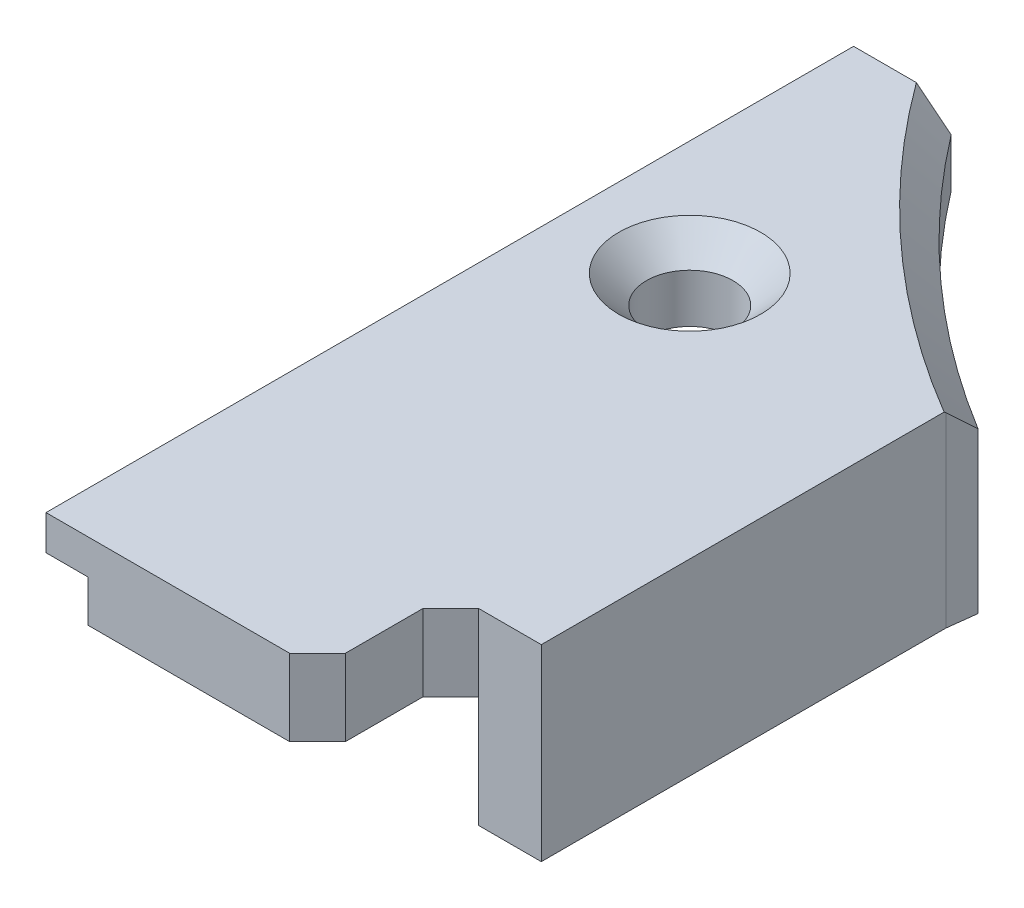
ISO-10303-21;
HEADER;
FILE_DESCRIPTION(('STEP AP214'),'2;1');
FILE_NAME('part.step','',(''),(''),'','','');
FILE_SCHEMA(('AUTOMOTIVE_DESIGN { 1 0 10303 214 1 1 1 1 }'));
ENDSEC;
DATA;
#1=APPLICATION_CONTEXT('core data for automotive mechanical design processes');
#2=APPLICATION_PROTOCOL_DEFINITION('international standard','automotive_design',2000,#1);
#3=PRODUCT_CONTEXT('',#1,'mechanical');
#4=PRODUCT('Part','Part','',(#3));
#5=PRODUCT_RELATED_PRODUCT_CATEGORY('part','',(#4));
#6=PRODUCT_DEFINITION_FORMATION('','',#4);
#7=PRODUCT_DEFINITION_CONTEXT('part definition',#1,'design');
#8=PRODUCT_DEFINITION('design','',#6,#7);
#9=PRODUCT_DEFINITION_SHAPE('','',#8);
#10=(LENGTH_UNIT() NAMED_UNIT(*) SI_UNIT(.MILLI.,.METRE.));
#11=(NAMED_UNIT(*) PLANE_ANGLE_UNIT() SI_UNIT($,.RADIAN.));
#12=(NAMED_UNIT(*) SI_UNIT($,.STERADIAN.) SOLID_ANGLE_UNIT());
#13=UNCERTAINTY_MEASURE_WITH_UNIT(LENGTH_MEASURE(1.E-05),#10,'distance_accuracy_value','');
#14=(GEOMETRIC_REPRESENTATION_CONTEXT(3) GLOBAL_UNCERTAINTY_ASSIGNED_CONTEXT((#13)) GLOBAL_UNIT_ASSIGNED_CONTEXT((#10,
#11,#12)) REPRESENTATION_CONTEXT('',''));
#15=CARTESIAN_POINT('',(0.,0.,0.));
#16=DIRECTION('',(0.,0.,1.));
#17=DIRECTION('',(1.,0.,0.));
#18=AXIS2_PLACEMENT_3D('',#15,#16,#17);
#19=CARTESIAN_POINT('',(0.,2.75,-10.0000000000344));
#20=DIRECTION('',(0.,0.,-1.));
#21=DIRECTION('',(-1.,0.,0.));
#22=AXIS2_PLACEMENT_3D('',#19,#20,#21);
#23=PLANE('',#22);
#24=DIRECTION('',(1.,0.,0.));
#25=VECTOR('',#24,1.);
#26=CARTESIAN_POINT('',(0.,2.75,-10.0000000000344));
#27=LINE('',#26,#25);
#28=CARTESIAN_POINT('',(12.75,2.75,-10.0000000000344));
#29=VERTEX_POINT('',#28);
#30=CARTESIAN_POINT('',(15.0042692933623,2.75,-10.0000000000345));
#31=VERTEX_POINT('',#30);
#32=EDGE_CURVE('E216',#29,#31,#27,.T.);
#33=ORIENTED_EDGE('',*,*,#32,.T.);
#34=CARTESIAN_POINT('',(15.0042692933623,2.75,-10.0000000000345));
#35=CARTESIAN_POINT('',(15.2117492556178,2.58253583239888,-10.0000000000345));
#36=CARTESIAN_POINT('',(15.4195485507509,2.41547041954059,-10.0000000000345));
#37=CARTESIAN_POINT('',(15.8357858282312,2.08213708612503,-10.0000000000345));
#38=CARTESIAN_POINT('',(16.0442238106442,1.91586916564998,-10.0000000000345));
#39=CARTESIAN_POINT('',(16.2529811260008,1.75,-10.0000000000345));
#40=B_SPLINE_CURVE_WITH_KNOTS('',3,(#34,#35,#36,#37,#38,#39),.UNSPECIFIED.,.F.,.F.,(4,2,4),(0.,
0.7998891129913,1.59977830845748),.UNSPECIFIED.);
#41=CARTESIAN_POINT('',(16.2529811260008,1.75,-10.0000000000345));
#42=VERTEX_POINT('',#41);
#43=EDGE_CURVE('E275',#31,#42,#40,.T.);
#44=ORIENTED_EDGE('',*,*,#43,.T.);
#45=DIRECTION('',(0.,-1.,0.));
#46=VECTOR('',#45,1.);
#47=CARTESIAN_POINT('',(16.2529811260008,2.75,-10.0000000000345));
#48=LINE('',#47,#46);
#49=CARTESIAN_POINT('',(16.2529811260008,0.,-10.0000000000345));
#50=VERTEX_POINT('',#49);
#51=EDGE_CURVE('E223',#42,#50,#48,.T.);
#52=ORIENTED_EDGE('',*,*,#51,.T.);
#53=DIRECTION('',(1.,0.,0.));
#54=VECTOR('',#53,1.);
#55=CARTESIAN_POINT('',(0.,0.,-10.0000000000344));
#56=LINE('',#55,#54);
#57=CARTESIAN_POINT('',(14.25,0.,-10.0000000000344));
#58=VERTEX_POINT('',#57);
#59=EDGE_CURVE('E225',#58,#50,#56,.T.);
#60=ORIENTED_EDGE('',*,*,#59,.F.);
#61=DIRECTION('',(0.,-1.,0.));
#62=VECTOR('',#61,1.);
#63=CARTESIAN_POINT('',(14.25,1.5,-10.0000000000344));
#64=LINE('',#63,#62);
#65=CARTESIAN_POINT('',(14.25,1.5,-10.0000000000344));
#66=VERTEX_POINT('',#65);
#67=EDGE_CURVE('E411',#66,#58,#64,.T.);
#68=ORIENTED_EDGE('',*,*,#67,.F.);
#69=DIRECTION('',(-1.,0.,0.));
#70=VECTOR('',#69,1.);
#71=CARTESIAN_POINT('',(12.5,1.5,-10.0000000000344));
#72=LINE('',#71,#70);
#73=CARTESIAN_POINT('',(12.75,1.5,-10.0000000000344));
#74=VERTEX_POINT('',#73);
#75=EDGE_CURVE('E408',#66,#74,#72,.T.);
#76=ORIENTED_EDGE('',*,*,#75,.T.);
#77=DIRECTION('',(0.,-1.,0.));
#78=VECTOR('',#77,1.);
#79=CARTESIAN_POINT('',(12.75,2.75,-10.0000000000344));
#80=LINE('',#79,#78);
#81=EDGE_CURVE('E398',#29,#74,#80,.T.);
#82=ORIENTED_EDGE('',*,*,#81,.F.);
#83=EDGE_LOOP('',(#33,#44,#52,#60,#68,#76,#82));
#84=FACE_BOUND('',#83,.T.);
#85=ADVANCED_FACE('F39',(#84),#23,.T.);
#86=CARTESIAN_POINT('',(12.5,13.8207949147356,18.9998850900372));
#87=DIRECTION('',(0.,0.,-1.));
#88=DIRECTION('',(-1.,0.,0.));
#89=AXIS2_PLACEMENT_3D('',#86,#87,#88);
#90=PLANE('',#89);
#91=DIRECTION('',(1.,0.,0.));
#92=VECTOR('',#91,1.);
#93=CARTESIAN_POINT('',(12.5,0.,18.9998850900372));
#94=LINE('',#93,#92);
#95=CARTESIAN_POINT('',(14.25,0.,18.9998850900372));
#96=VERTEX_POINT('',#95);
#97=CARTESIAN_POINT('',(21.5000000022068,0.,18.9998850900372));
#98=VERTEX_POINT('',#97);
#99=EDGE_CURVE('E210',#96,#98,#94,.T.);
#100=ORIENTED_EDGE('',*,*,#99,.T.);
#101=DIRECTION('',(0.,1.,0.));
#102=VECTOR('',#101,1.);
#103=CARTESIAN_POINT('',(21.5000000022068,13.8207949147356,18.9998850900372));
#104=LINE('',#103,#102);
#105=CARTESIAN_POINT('',(21.5000000022068,2.75,18.9998850900372));
#106=VERTEX_POINT('',#105);
#107=EDGE_CURVE('E312',#98,#106,#104,.T.);
#108=ORIENTED_EDGE('',*,*,#107,.T.);
#109=DIRECTION('',(1.,0.,0.));
#110=VECTOR('',#109,1.);
#111=CARTESIAN_POINT('',(12.5,2.75,18.9998850900372));
#112=LINE('',#111,#110);
#113=CARTESIAN_POINT('',(12.75,2.75,18.9998850900372));
#114=VERTEX_POINT('',#113);
#115=EDGE_CURVE('E212',#114,#106,#112,.T.);
#116=ORIENTED_EDGE('',*,*,#115,.F.);
#117=DIRECTION('',(0.,-1.,0.));
#118=VECTOR('',#117,1.);
#119=CARTESIAN_POINT('',(12.75,2.75,18.9998850900372));
#120=LINE('',#119,#118);
#121=CARTESIAN_POINT('',(12.75,1.5,18.9998850900372));
#122=VERTEX_POINT('',#121);
#123=EDGE_CURVE('E400',#114,#122,#120,.T.);
#124=ORIENTED_EDGE('',*,*,#123,.T.);
#125=DIRECTION('',(1.,0.,0.));
#126=VECTOR('',#125,1.);
#127=CARTESIAN_POINT('',(14.25,1.5,18.9998850900372));
#128=LINE('',#127,#126);
#129=CARTESIAN_POINT('',(14.25,1.5,18.9998850900372));
#130=VERTEX_POINT('',#129);
#131=EDGE_CURVE('E404',#122,#130,#128,.T.);
#132=ORIENTED_EDGE('',*,*,#131,.T.);
#133=DIRECTION('',(0.,-1.,0.));
#134=VECTOR('',#133,1.);
#135=CARTESIAN_POINT('',(14.25,1.5,18.9998850900372));
#136=LINE('',#135,#134);
#137=EDGE_CURVE('E197',#130,#96,#136,.T.);
#138=ORIENTED_EDGE('',*,*,#137,.T.);
#139=EDGE_LOOP('',(#100,#108,#116,#124,#132,#138));
#140=FACE_BOUND('',#139,.T.);
#141=ADVANCED_FACE('F288',(#140),#90,.F.);
#142=CARTESIAN_POINT('',(0.,2.75,0.));
#143=DIRECTION('',(0.,1.,0.));
#144=DIRECTION('',(0.,0.,1.));
#145=AXIS2_PLACEMENT_3D('',#142,#143,#144);
#146=PLANE('',#145);
#147=CARTESIAN_POINT('',(16.865979255,2.75,0.));
#148=DIRECTION('',(0.,1.,0.));
#149=DIRECTION('',(0.,0.,1.));
#150=AXIS2_PLACEMENT_3D('',#147,#148,#149);
#151=CIRCLE('',#150,2.55);
#152=CARTESIAN_POINT('',(16.865979255,2.75,2.55));
#153=VERTEX_POINT('',#152);
#154=EDGE_CURVE('E48',#153,#153,#151,.F.);
#155=ORIENTED_EDGE('',*,*,#154,.T.);
#156=EDGE_LOOP('',(#155));
#157=FACE_BOUND('',#156,.T.);
#158=DIRECTION('',(0.,0.,-1.));
#159=VECTOR('',#158,1.);
#160=CARTESIAN_POINT('',(25.7500000022048,2.75,0.));
#161=LINE('',#160,#159);
#162=CARTESIAN_POINT('',(25.7500000022048,2.75,14.2136291741262));
#163=VERTEX_POINT('',#162);
#164=CARTESIAN_POINT('',(25.7500000022048,2.75,-0.251054000046067));
#165=VERTEX_POINT('',#164);
#166=EDGE_CURVE('E200',#163,#165,#161,.T.);
#167=ORIENTED_EDGE('',*,*,#166,.T.);
#168=CARTESIAN_POINT('',(44.1426755627633,2.75,-31.3209847267169));
#169=DIRECTION('',(0.,1.,0.));
#170=DIRECTION('',(0.,0.,1.));
#171=AXIS2_PLACEMENT_3D('',#168,#169,#170);
#172=CIRCLE('',#171,36.1058320723411);
#173=EDGE_CURVE('E283',#165,#31,#172,.F.);
#174=ORIENTED_EDGE('',*,*,#173,.T.);
#175=ORIENTED_EDGE('',*,*,#32,.F.);
#176=DIRECTION('',(0.,0.,-1.));
#177=VECTOR('',#176,1.);
#178=CARTESIAN_POINT('',(12.75,2.75,-10.0000000000344));
#179=LINE('',#178,#177);
#180=EDGE_CURVE('E180',#114,#29,#179,.T.);
#181=ORIENTED_EDGE('',*,*,#180,.F.);
#182=ORIENTED_EDGE('',*,*,#115,.T.);
#183=DIRECTION('',(-0.707106781186549,0.,0.707106781186546));
#184=VECTOR('',#183,1.);
#185=CARTESIAN_POINT('',(20.2499425461219,2.75,20.249942546122));
#186=LINE('',#185,#184);
#187=CARTESIAN_POINT('',(22.5000000022068,2.75,17.9998850900372));
#188=VERTEX_POINT('',#187);
#189=EDGE_CURVE('E320',#106,#188,#186,.F.);
#190=ORIENTED_EDGE('',*,*,#189,.T.);
#191=DIRECTION('',(0.,0.,-1.));
#192=VECTOR('',#191,1.);
#193=CARTESIAN_POINT('',(22.5000000022068,2.75,0.));
#194=LINE('',#193,#192);
#195=CARTESIAN_POINT('',(22.5000000022068,2.75,15.2136291741262));
#196=VERTEX_POINT('',#195);
#197=EDGE_CURVE('E219',#188,#196,#194,.T.);
#198=ORIENTED_EDGE('',*,*,#197,.T.);
#199=DIRECTION('',(-0.70710678118655,0.,0.707106781186545));
#200=VECTOR('',#199,1.);
#201=CARTESIAN_POINT('',(23.5000000022068,2.75,14.2136291741262));
#202=LINE('',#201,#200);
#203=CARTESIAN_POINT('',(23.5000000022068,2.75,14.2136291741262));
#204=VERTEX_POINT('',#203);
#205=EDGE_CURVE('E323',#196,#204,#202,.F.);
#206=ORIENTED_EDGE('',*,*,#205,.T.);
#207=DIRECTION('',(1.,0.,0.));
#208=VECTOR('',#207,1.);
#209=CARTESIAN_POINT('',(0.,2.75,14.2136291741262));
#210=LINE('',#209,#208);
#211=EDGE_CURVE('E191',#204,#163,#210,.T.);
#212=ORIENTED_EDGE('',*,*,#211,.T.);
#213=EDGE_LOOP('',(#167,#174,#175,#181,#182,#190,#198,#206,#212));
#214=FACE_BOUND('',#213,.T.);
#215=ADVANCED_FACE('F302',(#157,#214),#146,.T.);
#216=CARTESIAN_POINT('',(0.,1.5,0.));
#217=DIRECTION('',(0.,-1.,0.));
#218=DIRECTION('',(0.,0.,-1.));
#219=AXIS2_PLACEMENT_3D('',#216,#217,#218);
#220=PLANE('',#219);
#221=ORIENTED_EDGE('',*,*,#131,.F.);
#222=DIRECTION('',(0.,0.,-1.));
#223=VECTOR('',#222,1.);
#224=CARTESIAN_POINT('',(12.75,1.5,0.));
#225=LINE('',#224,#223);
#226=EDGE_CURVE('E234',#122,#74,#225,.T.);
#227=ORIENTED_EDGE('',*,*,#226,.T.);
#228=ORIENTED_EDGE('',*,*,#75,.F.);
#229=DIRECTION('',(0.,0.,-1.));
#230=VECTOR('',#229,1.);
#231=CARTESIAN_POINT('',(14.25,1.5,-10.0000000000344));
#232=LINE('',#231,#230);
#233=EDGE_CURVE('E406',#130,#66,#232,.T.);
#234=ORIENTED_EDGE('',*,*,#233,.F.);
#235=EDGE_LOOP('',(#221,#227,#228,#234));
#236=FACE_BOUND('',#235,.T.);
#237=ADVANCED_FACE('F301',(#236),#220,.T.);
#238=CARTESIAN_POINT('',(0.,0.,0.));
#239=DIRECTION('',(0.,1.,0.));
#240=DIRECTION('',(0.,0.,1.));
#241=AXIS2_PLACEMENT_3D('',#238,#239,#240);
#242=PLANE('',#241);
#243=DIRECTION('',(-1.,0.,0.));
#244=VECTOR('',#243,1.);
#245=CARTESIAN_POINT('',(0.,0.,7.51362917405731));
#246=LINE('',#245,#244);
#247=CARTESIAN_POINT('',(24.7500000022057,0.,7.51362917405731));
#248=VERTEX_POINT('',#247);
#249=CARTESIAN_POINT('',(23.5000000022068,0.,7.51362917405731));
#250=VERTEX_POINT('',#249);
#251=EDGE_CURVE('E181',#248,#250,#246,.T.);
#252=ORIENTED_EDGE('',*,*,#251,.T.);
#253=DIRECTION('',(0.,0.,1.));
#254=VECTOR('',#253,1.);
#255=CARTESIAN_POINT('',(23.5000000022068,0.,0.));
#256=LINE('',#255,#254);
#257=CARTESIAN_POINT('',(23.5000000022068,0.,14.2136291741262));
#258=VERTEX_POINT('',#257);
#259=EDGE_CURVE('E179',#250,#258,#256,.T.);
#260=ORIENTED_EDGE('',*,*,#259,.T.);
#261=DIRECTION('',(0.70710678118655,0.,-0.707106781186545));
#262=VECTOR('',#261,1.);
#263=CARTESIAN_POINT('',(18.8568145881664,0.,18.8568145881665));
#264=LINE('',#263,#262);
#265=CARTESIAN_POINT('',(22.5000000022068,0.,15.2136291741262));
#266=VERTEX_POINT('',#265);
#267=EDGE_CURVE('E321',#258,#266,#264,.F.);
#268=ORIENTED_EDGE('',*,*,#267,.T.);
#269=DIRECTION('',(0.,0.,-1.));
#270=VECTOR('',#269,1.);
#271=CARTESIAN_POINT('',(22.5000000022068,0.,0.));
#272=LINE('',#271,#270);
#273=CARTESIAN_POINT('',(22.5000000022068,0.,17.9998850900372));
#274=VERTEX_POINT('',#273);
#275=EDGE_CURVE('E228',#274,#266,#272,.T.);
#276=ORIENTED_EDGE('',*,*,#275,.F.);
#277=DIRECTION('',(0.707106781186549,0.,-0.707106781186546));
#278=VECTOR('',#277,1.);
#279=CARTESIAN_POINT('',(22.5000000022068,0.,17.9998850900372));
#280=LINE('',#279,#278);
#281=EDGE_CURVE('E63',#274,#98,#280,.F.);
#282=ORIENTED_EDGE('',*,*,#281,.T.);
#283=ORIENTED_EDGE('',*,*,#99,.F.);
#284=DIRECTION('',(0.,0.,-1.));
#285=VECTOR('',#284,1.);
#286=CARTESIAN_POINT('',(14.25,0.,-10.0000000000344));
#287=LINE('',#286,#285);
#288=EDGE_CURVE('E403',#96,#58,#287,.T.);
#289=ORIENTED_EDGE('',*,*,#288,.T.);
#290=ORIENTED_EDGE('',*,*,#59,.T.);
#291=CARTESIAN_POINT('',(44.1426755627633,0.,-31.3209847267169));
#292=DIRECTION('',(0.,1.,0.));
#293=DIRECTION('',(0.,0.,1.));
#294=AXIS2_PLACEMENT_3D('',#291,#292,#293);
#295=CIRCLE('',#294,35.1058320723411);
#296=CARTESIAN_POINT('',(24.9466325339046,0.,-1.92827512849145));
#297=VERTEX_POINT('',#296);
#298=EDGE_CURVE('E215',#50,#297,#295,.T.);
#299=ORIENTED_EDGE('',*,*,#298,.T.);
#300=DIRECTION('',(-0.12080275843464,0.,0.992676530172131));
#301=VECTOR('',#300,1.);
#302=CARTESIAN_POINT('',(24.3513436620657,0.,2.96341194392631));
#303=LINE('',#302,#301);
#304=CARTESIAN_POINT('',(24.7500000022057,0.,-0.312480076994557));
#305=VERTEX_POINT('',#304);
#306=EDGE_CURVE('E393',#297,#305,#303,.T.);
#307=ORIENTED_EDGE('',*,*,#306,.T.);
#308=DIRECTION('',(0.,0.,1.));
#309=VECTOR('',#308,1.);
#310=CARTESIAN_POINT('',(24.7500000022057,0.,0.));
#311=LINE('',#310,#309);
#312=EDGE_CURVE('E384',#305,#248,#311,.T.);
#313=ORIENTED_EDGE('',*,*,#312,.T.);
#314=EDGE_LOOP('',(#252,#260,#268,#276,#282,#283,#289,#290,#299,#307,#313));
#315=FACE_BOUND('',#314,.T.);
#316=CARTESIAN_POINT('',(16.865979255,0.,0.));
#317=DIRECTION('',(0.,1.,0.));
#318=DIRECTION('',(0.,0.,1.));
#319=AXIS2_PLACEMENT_3D('',#316,#317,#318);
#320=CIRCLE('',#319,1.55);
#321=CARTESIAN_POINT('',(16.865979255,0.,1.55));
#322=VERTEX_POINT('',#321);
#323=EDGE_CURVE('E220',#322,#322,#320,.F.);
#324=ORIENTED_EDGE('',*,*,#323,.F.);
#325=EDGE_LOOP('',(#324));
#326=FACE_BOUND('',#325,.T.);
#327=ADVANCED_FACE('F293',(#315,#326),#242,.F.);
#328=CARTESIAN_POINT('',(22.5000000022068,2.75,0.));
#329=DIRECTION('',(-1.,0.,0.));
#330=DIRECTION('',(0.,0.,1.));
#331=AXIS2_PLACEMENT_3D('',#328,#329,#330);
#332=PLANE('',#331);
#333=ORIENTED_EDGE('',*,*,#275,.T.);
#334=DIRECTION('',(0.,1.,0.));
#335=VECTOR('',#334,1.);
#336=CARTESIAN_POINT('',(22.5000000022068,2.75,15.2136291741262));
#337=LINE('',#336,#335);
#338=EDGE_CURVE('E325',#266,#196,#337,.T.);
#339=ORIENTED_EDGE('',*,*,#338,.T.);
#340=ORIENTED_EDGE('',*,*,#197,.F.);
#341=DIRECTION('',(0.,-1.,0.));
#342=VECTOR('',#341,1.);
#343=CARTESIAN_POINT('',(22.5000000022068,2.75,17.9998850900372));
#344=LINE('',#343,#342);
#345=EDGE_CURVE('E381',#188,#274,#344,.T.);
#346=ORIENTED_EDGE('',*,*,#345,.T.);
#347=EDGE_LOOP('',(#333,#339,#340,#346));
#348=FACE_BOUND('',#347,.T.);
#349=ADVANCED_FACE('F290',(#348),#332,.F.);
#350=CARTESIAN_POINT('',(44.1426755627633,2.75,-31.3209847267169));
#351=DIRECTION('',(0.,-1.,0.));
#352=DIRECTION('',(0.,0.,-1.));
#353=AXIS2_PLACEMENT_3D('',#350,#351,#352);
#354=CYLINDRICAL_SURFACE('',#353,35.1058320723411);
#355=DIRECTION('',(0.,-1.,0.));
#356=VECTOR('',#355,1.);
#357=CARTESIAN_POINT('',(24.9466325339046,9.70281417801352,-1.92827512849146));
#358=LINE('',#357,#356);
#359=CARTESIAN_POINT('',(24.9466325339046,-4.,-1.92827512849146));
#360=VERTEX_POINT('',#359);
#361=EDGE_CURVE('E171',#297,#360,#358,.T.);
#362=ORIENTED_EDGE('',*,*,#361,.F.);
#363=ORIENTED_EDGE('',*,*,#298,.F.);
#364=ORIENTED_EDGE('',*,*,#51,.F.);
#365=CARTESIAN_POINT('',(44.1426755627633,1.75,-31.3209847267169));
#366=DIRECTION('',(0.,1.,0.));
#367=DIRECTION('',(0.,0.,1.));
#368=AXIS2_PLACEMENT_3D('',#365,#366,#367);
#369=CIRCLE('',#368,35.1058320723411);
#370=CARTESIAN_POINT('',(25.8753196118497,1.75,-1.34227307904881));
#371=VERTEX_POINT('',#370);
#372=EDGE_CURVE('E237',#42,#371,#369,.T.);
#373=ORIENTED_EDGE('',*,*,#372,.T.);
#374=DIRECTION('',(0.,-1.,0.));
#375=VECTOR('',#374,1.);
#376=CARTESIAN_POINT('',(25.8753196118497,19.3902867465702,-1.34227307904881));
#377=LINE('',#376,#375);
#378=CARTESIAN_POINT('',(25.8753196118497,-4.,-1.34227307904881));
#379=VERTEX_POINT('',#378);
#380=EDGE_CURVE('E206',#371,#379,#377,.T.);
#381=ORIENTED_EDGE('',*,*,#380,.T.);
#382=CARTESIAN_POINT('',(44.1426755627633,-4.,-31.3209847267169));
#383=DIRECTION('',(0.,1.,0.));
#384=DIRECTION('',(0.,0.,1.));
#385=AXIS2_PLACEMENT_3D('',#382,#383,#384);
#386=CIRCLE('',#385,35.1058320723411);
#387=EDGE_CURVE('E189',#360,#379,#386,.T.);
#388=ORIENTED_EDGE('',*,*,#387,.F.);
#389=EDGE_LOOP('',(#362,#363,#364,#373,#381,#388));
#390=FACE_BOUND('',#389,.T.);
#391=ADVANCED_FACE('F270',(#390),#354,.F.);
#392=CARTESIAN_POINT('',(16.865979255,2.75,0.));
#393=DIRECTION('',(0.,-1.,0.));
#394=DIRECTION('',(0.,0.,-1.));
#395=AXIS2_PLACEMENT_3D('',#392,#393,#394);
#396=CYLINDRICAL_SURFACE('',#395,1.55);
#397=CARTESIAN_POINT('',(16.865979255,1.75,0.));
#398=DIRECTION('',(0.,1.,0.));
#399=DIRECTION('',(0.,0.,1.));
#400=AXIS2_PLACEMENT_3D('',#397,#398,#399);
#401=CIRCLE('',#400,1.55);
#402=CARTESIAN_POINT('',(16.865979255,1.75,1.55));
#403=VERTEX_POINT('',#402);
#404=EDGE_CURVE('E11',#403,#403,#401,.T.);
#405=ORIENTED_EDGE('',*,*,#404,.T.);
#406=EDGE_LOOP('',(#405));
#407=FACE_BOUND('',#406,.T.);
#408=ORIENTED_EDGE('',*,*,#323,.T.);
#409=EDGE_LOOP('',(#408));
#410=FACE_BOUND('',#409,.T.);
#411=ADVANCED_FACE('F295',(#407,#410),#396,.F.);
#412=CARTESIAN_POINT('',(25.3367503556194,19.3902867465702,3.08333000700447));
#413=DIRECTION('',(0.99267653017213,0.,0.120802758434646));
#414=DIRECTION('',(0.120802758434646,0.,-0.992676530172131));
#415=AXIS2_PLACEMENT_3D('',#412,#413,#414);
#416=PLANE('',#415);
#417=ORIENTED_EDGE('',*,*,#380,.F.);
#418=CARTESIAN_POINT('',(25.8753196118497,1.75,-1.3422730790488));
#419=CARTESIAN_POINT('',(25.8544077805956,1.9076304171554,-1.17043359162436));
#420=CARTESIAN_POINT('',(25.8335085641041,2.06537520727255,-0.998697763908384));
#421=CARTESIAN_POINT('',(25.7917353608894,2.38109353159139,-0.655433429892718));
#422=CARTESIAN_POINT('',(25.770861374166,2.53906706579043,-0.483904923590615));
#423=CARTESIAN_POINT('',(25.7500000022048,2.69715497294854,-0.312480076994557));
#424=B_SPLINE_CURVE_WITH_KNOTS('',3,(#418,#419,#420,#421,#422,#423),.UNSPECIFIED.,.F.,.F.,(4,2,
4),(0.,0.702367791988777,1.40473557579556),.UNSPECIFIED.);
#425=CARTESIAN_POINT('',(25.7500000022048,2.69715497294854,-0.312480076994556));
#426=VERTEX_POINT('',#425);
#427=EDGE_CURVE('E240',#371,#426,#424,.T.);
#428=ORIENTED_EDGE('',*,*,#427,.T.);
#429=DIRECTION('',(0.,-1.,0.));
#430=VECTOR('',#429,1.);
#431=CARTESIAN_POINT('',(25.7500000022048,19.3902867465702,-0.312480076994556));
#432=LINE('',#431,#430);
#433=CARTESIAN_POINT('',(25.7500000022048,-4.,-0.312480076994556));
#434=VERTEX_POINT('',#433);
#435=EDGE_CURVE('E203',#426,#434,#432,.T.);
#436=ORIENTED_EDGE('',*,*,#435,.T.);
#437=DIRECTION('',(-0.120802758434646,0.,0.992676530172131));
#438=VECTOR('',#437,1.);
#439=CARTESIAN_POINT('',(25.3367503556194,-4.,3.08333000700447));
#440=LINE('',#439,#438);
#441=EDGE_CURVE('E193',#379,#434,#440,.T.);
#442=ORIENTED_EDGE('',*,*,#441,.F.);
#443=EDGE_LOOP('',(#417,#428,#436,#442));
#444=FACE_BOUND('',#443,.T.);
#445=ADVANCED_FACE('F255',(#444),#416,.T.);
#446=CARTESIAN_POINT('',(25.7500000022048,19.3902867465702,0.));
#447=DIRECTION('',(-1.,0.,0.));
#448=DIRECTION('',(0.,0.,1.));
#449=AXIS2_PLACEMENT_3D('',#446,#447,#448);
#450=PLANE('',#449);
#451=ORIENTED_EDGE('',*,*,#435,.F.);
#452=CARTESIAN_POINT('',(25.7500000022048,2.69715497294854,-0.312480076994556));
#453=CARTESIAN_POINT('',(25.7500000022048,2.70596117591944,-0.302241277786558));
#454=CARTESIAN_POINT('',(25.7500000022048,2.71476802965919,-0.292003038436837));
#455=CARTESIAN_POINT('',(25.7500000022048,2.73238303867635,-0.271527679454007));
#456=CARTESIAN_POINT('',(25.7500000022048,2.74119119395375,-0.261290559820899));
#457=CARTESIAN_POINT('',(25.7500000022048,2.75,-0.251054000046067));
#458=B_SPLINE_CURVE_WITH_KNOTS('',3,(#452,#453,#454,#455,#456,#457),.UNSPECIFIED.,.F.,.F.,(4,2,
4),(0.,0.040514688200453,0.0810293764006661),.UNSPECIFIED.);
#459=EDGE_CURVE('E248',#426,#165,#458,.T.);
#460=ORIENTED_EDGE('',*,*,#459,.T.);
#461=ORIENTED_EDGE('',*,*,#166,.F.);
#462=DIRECTION('',(0.,-1.,0.));
#463=VECTOR('',#462,1.);
#464=CARTESIAN_POINT('',(25.7500000022048,19.3902867465702,14.2136291741262));
#465=LINE('',#464,#463);
#466=CARTESIAN_POINT('',(25.7500000022048,-4.,14.2136291741262));
#467=VERTEX_POINT('',#466);
#468=EDGE_CURVE('E204',#163,#467,#465,.T.);
#469=ORIENTED_EDGE('',*,*,#468,.T.);
#470=DIRECTION('',(0.,0.,-1.));
#471=VECTOR('',#470,1.);
#472=CARTESIAN_POINT('',(25.7500000022048,-4.,0.));
#473=LINE('',#472,#471);
#474=EDGE_CURVE('E416',#467,#434,#473,.T.);
#475=ORIENTED_EDGE('',*,*,#474,.T.);
#476=EDGE_LOOP('',(#451,#460,#461,#469,#475));
#477=FACE_BOUND('',#476,.T.);
#478=ADVANCED_FACE('F374',(#477),#450,.F.);
#479=CARTESIAN_POINT('',(0.,19.3902867465702,14.2136291741262));
#480=DIRECTION('',(0.,0.,-1.));
#481=DIRECTION('',(-1.,0.,0.));
#482=AXIS2_PLACEMENT_3D('',#479,#480,#481);
#483=PLANE('',#482);
#484=ORIENTED_EDGE('',*,*,#211,.F.);
#485=DIRECTION('',(0.,-1.,0.));
#486=VECTOR('',#485,1.);
#487=CARTESIAN_POINT('',(23.5000000022068,0.,14.2136291741262));
#488=LINE('',#487,#486);
#489=EDGE_CURVE('E282',#204,#258,#488,.T.);
#490=ORIENTED_EDGE('',*,*,#489,.T.);
#491=DIRECTION('',(0.,1.,0.));
#492=VECTOR('',#491,1.);
#493=CARTESIAN_POINT('',(23.5000000022068,-4.,14.2136291741262));
#494=LINE('',#493,#492);
#495=CARTESIAN_POINT('',(23.5000000022068,-4.,14.2136291741262));
#496=VERTEX_POINT('',#495);
#497=EDGE_CURVE('E188',#496,#258,#494,.T.);
#498=ORIENTED_EDGE('',*,*,#497,.F.);
#499=DIRECTION('',(1.,0.,0.));
#500=VECTOR('',#499,1.);
#501=CARTESIAN_POINT('',(0.,-4.,14.2136291741262));
#502=LINE('',#501,#500);
#503=EDGE_CURVE('E187',#496,#467,#502,.T.);
#504=ORIENTED_EDGE('',*,*,#503,.T.);
#505=ORIENTED_EDGE('',*,*,#468,.F.);
#506=EDGE_LOOP('',(#484,#490,#498,#504,#505));
#507=FACE_BOUND('',#506,.T.);
#508=ADVANCED_FACE('F369',(#507),#483,.F.);
#509=CARTESIAN_POINT('',(23.5000000022068,-4.,0.));
#510=DIRECTION('',(-1.,0.,0.));
#511=DIRECTION('',(0.,0.,1.));
#512=AXIS2_PLACEMENT_3D('',#509,#510,#511);
#513=PLANE('',#512);
#514=DIRECTION('',(0.,-1.,0.));
#515=VECTOR('',#514,1.);
#516=CARTESIAN_POINT('',(23.5000000022068,9.70281417801352,7.51362917405731));
#517=LINE('',#516,#515);
#518=CARTESIAN_POINT('',(23.5000000022068,-4.,7.51362917405731));
#519=VERTEX_POINT('',#518);
#520=EDGE_CURVE('E166',#250,#519,#517,.T.);
#521=ORIENTED_EDGE('',*,*,#520,.T.);
#522=DIRECTION('',(0.,0.,1.));
#523=VECTOR('',#522,1.);
#524=CARTESIAN_POINT('',(23.5000000022068,-4.,0.));
#525=LINE('',#524,#523);
#526=EDGE_CURVE('E177',#519,#496,#525,.T.);
#527=ORIENTED_EDGE('',*,*,#526,.T.);
#528=ORIENTED_EDGE('',*,*,#497,.T.);
#529=ORIENTED_EDGE('',*,*,#259,.F.);
#530=EDGE_LOOP('',(#521,#527,#528,#529));
#531=FACE_BOUND('',#530,.T.);
#532=ADVANCED_FACE('F175',(#531),#513,.T.);
#533=CARTESIAN_POINT('',(0.,-4.,0.));
#534=DIRECTION('',(0.,1.,0.));
#535=DIRECTION('',(0.,0.,1.));
#536=AXIS2_PLACEMENT_3D('',#533,#534,#535);
#537=PLANE('',#536);
#538=DIRECTION('',(0.,0.,1.));
#539=VECTOR('',#538,1.);
#540=CARTESIAN_POINT('',(24.7500000022057,-4.,0.));
#541=LINE('',#540,#539);
#542=CARTESIAN_POINT('',(24.7500000022057,-4.,-0.312480076994557));
#543=VERTEX_POINT('',#542);
#544=CARTESIAN_POINT('',(24.7500000022057,-4.,7.51362917405731));
#545=VERTEX_POINT('',#544);
#546=EDGE_CURVE('E55',#543,#545,#541,.T.);
#547=ORIENTED_EDGE('',*,*,#546,.F.);
#548=DIRECTION('',(-0.12080275843464,0.,0.992676530172131));
#549=VECTOR('',#548,1.);
#550=CARTESIAN_POINT('',(24.3513436620657,-4.,2.96341194392631));
#551=LINE('',#550,#549);
#552=EDGE_CURVE('E389',#360,#543,#551,.T.);
#553=ORIENTED_EDGE('',*,*,#552,.F.);
#554=ORIENTED_EDGE('',*,*,#387,.T.);
#555=ORIENTED_EDGE('',*,*,#441,.T.);
#556=ORIENTED_EDGE('',*,*,#474,.F.);
#557=ORIENTED_EDGE('',*,*,#503,.F.);
#558=ORIENTED_EDGE('',*,*,#526,.F.);
#559=DIRECTION('',(-1.,0.,0.));
#560=VECTOR('',#559,1.);
#561=CARTESIAN_POINT('',(0.,-4.,7.51362917405731));
#562=LINE('',#561,#560);
#563=EDGE_CURVE('E163',#545,#519,#562,.T.);
#564=ORIENTED_EDGE('',*,*,#563,.F.);
#565=EDGE_LOOP('',(#547,#553,#554,#555,#556,#557,#558,#564));
#566=FACE_BOUND('',#565,.T.);
#567=ADVANCED_FACE('F184',(#566),#537,.F.);
#568=CARTESIAN_POINT('',(14.25,1.5,-10.0000000000344));
#569=DIRECTION('',(-1.,0.,0.));
#570=DIRECTION('',(0.,0.,1.));
#571=AXIS2_PLACEMENT_3D('',#568,#569,#570);
#572=PLANE('',#571);
#573=ORIENTED_EDGE('',*,*,#288,.F.);
#574=ORIENTED_EDGE('',*,*,#137,.F.);
#575=ORIENTED_EDGE('',*,*,#233,.T.);
#576=ORIENTED_EDGE('',*,*,#67,.T.);
#577=EDGE_LOOP('',(#573,#574,#575,#576));
#578=FACE_BOUND('',#577,.T.);
#579=ADVANCED_FACE('F431',(#578),#572,.T.);
#580=CARTESIAN_POINT('',(12.75,2.75,-10.0000000000344));
#581=DIRECTION('',(-1.,0.,0.));
#582=DIRECTION('',(0.,0.,1.));
#583=AXIS2_PLACEMENT_3D('',#580,#581,#582);
#584=PLANE('',#583);
#585=ORIENTED_EDGE('',*,*,#123,.F.);
#586=ORIENTED_EDGE('',*,*,#180,.T.);
#587=ORIENTED_EDGE('',*,*,#81,.T.);
#588=ORIENTED_EDGE('',*,*,#226,.F.);
#589=EDGE_LOOP('',(#585,#586,#587,#588));
#590=FACE_BOUND('',#589,.T.);
#591=ADVANCED_FACE('F268',(#590),#584,.T.);
#592=CARTESIAN_POINT('',(44.1426755627633,1.75,-31.3209847267169));
#593=DIRECTION('',(0.,1.,0.));
#594=DIRECTION('',(0.,0.,1.));
#595=AXIS2_PLACEMENT_3D('',#592,#593,#594);
#596=CONICAL_SURFACE('',#595,35.1058320723411,0.785398163397447);
#597=ORIENTED_EDGE('',*,*,#43,.F.);
#598=ORIENTED_EDGE('',*,*,#173,.F.);
#599=ORIENTED_EDGE('',*,*,#459,.F.);
#600=ORIENTED_EDGE('',*,*,#427,.F.);
#601=ORIENTED_EDGE('',*,*,#372,.F.);
#602=EDGE_LOOP('',(#597,#598,#599,#600,#601));
#603=FACE_BOUND('',#602,.T.);
#604=ADVANCED_FACE('F259',(#603),#596,.F.);
#605=CARTESIAN_POINT('',(23.5000000022068,19.3902867465702,14.2136291741262));
#606=DIRECTION('',(0.707106781186545,0.,0.70710678118655));
#607=DIRECTION('',(0.,1.,0.));
#608=AXIS2_PLACEMENT_3D('',#605,#606,#607);
#609=PLANE('',#608);
#610=ORIENTED_EDGE('',*,*,#205,.F.);
#611=ORIENTED_EDGE('',*,*,#338,.F.);
#612=ORIENTED_EDGE('',*,*,#267,.F.);
#613=ORIENTED_EDGE('',*,*,#489,.F.);
#614=EDGE_LOOP('',(#610,#611,#612,#613));
#615=FACE_BOUND('',#614,.T.);
#616=ADVANCED_FACE('F267',(#615),#609,.T.);
#617=CARTESIAN_POINT('',(22.5000000022068,2.75,17.9998850900372));
#618=DIRECTION('',(-0.707106781186546,0.,-0.707106781186549));
#619=DIRECTION('',(0.,-1.,0.));
#620=AXIS2_PLACEMENT_3D('',#617,#618,#619);
#621=PLANE('',#620);
#622=ORIENTED_EDGE('',*,*,#189,.F.);
#623=ORIENTED_EDGE('',*,*,#107,.F.);
#624=ORIENTED_EDGE('',*,*,#281,.F.);
#625=ORIENTED_EDGE('',*,*,#345,.F.);
#626=EDGE_LOOP('',(#622,#623,#624,#625));
#627=FACE_BOUND('',#626,.T.);
#628=ADVANCED_FACE('F317',(#627),#621,.F.);
#629=CARTESIAN_POINT('',(16.865979255,2.75,0.));
#630=DIRECTION('',(0.,1.,0.));
#631=DIRECTION('',(0.,0.,1.));
#632=AXIS2_PLACEMENT_3D('',#629,#630,#631);
#633=CONICAL_SURFACE('',#632,2.55,0.785398163397449);
#634=ORIENTED_EDGE('',*,*,#404,.F.);
#635=EDGE_LOOP('',(#634));
#636=FACE_BOUND('',#635,.T.);
#637=ORIENTED_EDGE('',*,*,#154,.F.);
#638=EDGE_LOOP('',(#637));
#639=FACE_BOUND('',#638,.T.);
#640=ADVANCED_FACE('F42',(#636,#639),#633,.F.);
#641=CARTESIAN_POINT('',(24.3513436620657,9.70281417801352,2.96341194392631));
#642=DIRECTION('',(0.992676530172131,0.,0.12080275843464));
#643=DIRECTION('',(0.12080275843464,0.,-0.992676530172131));
#644=AXIS2_PLACEMENT_3D('',#641,#642,#643);
#645=PLANE('',#644);
#646=ORIENTED_EDGE('',*,*,#361,.T.);
#647=ORIENTED_EDGE('',*,*,#552,.T.);
#648=DIRECTION('',(0.,-1.,0.));
#649=VECTOR('',#648,1.);
#650=CARTESIAN_POINT('',(24.7500000022057,9.70281417801352,-0.312480076994557));
#651=LINE('',#650,#649);
#652=EDGE_CURVE('E392',#305,#543,#651,.T.);
#653=ORIENTED_EDGE('',*,*,#652,.F.);
#654=ORIENTED_EDGE('',*,*,#306,.F.);
#655=EDGE_LOOP('',(#646,#647,#653,#654));
#656=FACE_BOUND('',#655,.T.);
#657=ADVANCED_FACE('F334',(#656),#645,.F.);
#658=CARTESIAN_POINT('',(24.7500000022057,9.70281417801352,0.));
#659=DIRECTION('',(1.,0.,0.));
#660=DIRECTION('',(0.,0.,-1.));
#661=AXIS2_PLACEMENT_3D('',#658,#659,#660);
#662=PLANE('',#661);
#663=ORIENTED_EDGE('',*,*,#652,.T.);
#664=ORIENTED_EDGE('',*,*,#546,.T.);
#665=DIRECTION('',(0.,-1.,0.));
#666=VECTOR('',#665,1.);
#667=CARTESIAN_POINT('',(24.7500000022057,9.70281417801352,7.51362917405731));
#668=LINE('',#667,#666);
#669=EDGE_CURVE('E168',#248,#545,#668,.T.);
#670=ORIENTED_EDGE('',*,*,#669,.F.);
#671=ORIENTED_EDGE('',*,*,#312,.F.);
#672=EDGE_LOOP('',(#663,#664,#670,#671));
#673=FACE_BOUND('',#672,.T.);
#674=ADVANCED_FACE('F340',(#673),#662,.F.);
#675=CARTESIAN_POINT('',(0.,9.70281417801352,7.51362917405731));
#676=DIRECTION('',(0.,0.,1.));
#677=DIRECTION('',(1.,0.,0.));
#678=AXIS2_PLACEMENT_3D('',#675,#676,#677);
#679=PLANE('',#678);
#680=ORIENTED_EDGE('',*,*,#669,.T.);
#681=ORIENTED_EDGE('',*,*,#563,.T.);
#682=ORIENTED_EDGE('',*,*,#520,.F.);
#683=ORIENTED_EDGE('',*,*,#251,.F.);
#684=EDGE_LOOP('',(#680,#681,#682,#683));
#685=FACE_BOUND('',#684,.T.);
#686=ADVANCED_FACE('F165',(#685),#679,.F.);
#687=CLOSED_SHELL('',(#85,#141,#215,#237,#327,#349,#391,#411,#445,#478,#508,#532,#567,#579,#591,
#604,#616,#628,#640,#657,#674,#686));
#688=MANIFOLD_SOLID_BREP('B2',#687);
#689=ADVANCED_BREP_SHAPE_REPRESENTATION('',(#18,#688),#14);
#690=SHAPE_DEFINITION_REPRESENTATION(#9,#689);
ENDSEC;
END-ISO-10303-21;
